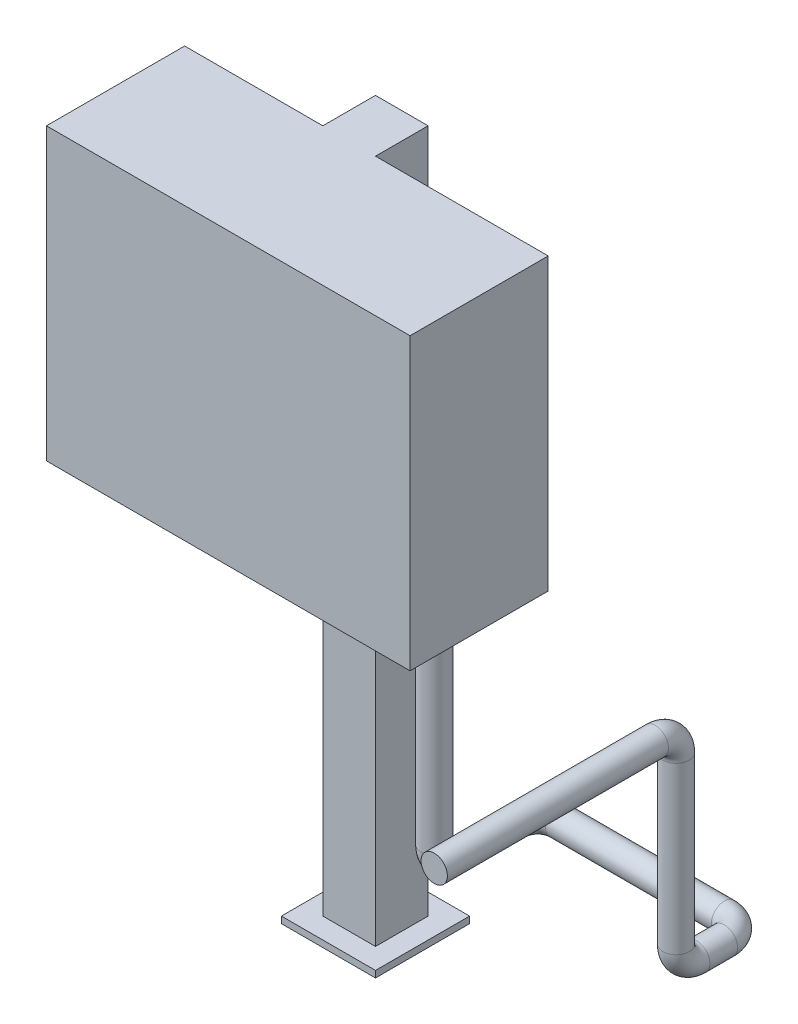
ISO-10303-21;
HEADER;
FILE_DESCRIPTION(('STEP AP214'),'2;1');
FILE_NAME('part.step','',(''),(''),'','','');
FILE_SCHEMA(('AUTOMOTIVE_DESIGN { 1 0 10303 214 1 1 1 1 }'));
ENDSEC;
DATA;
#1=APPLICATION_CONTEXT('core data for automotive mechanical design processes');
#2=APPLICATION_PROTOCOL_DEFINITION('international standard','automotive_design',2000,#1);
#3=PRODUCT_CONTEXT('',#1,'mechanical');
#4=PRODUCT('Part','Part','',(#3));
#5=PRODUCT_RELATED_PRODUCT_CATEGORY('part','',(#4));
#6=PRODUCT_DEFINITION_FORMATION('','',#4);
#7=PRODUCT_DEFINITION_CONTEXT('part definition',#1,'design');
#8=PRODUCT_DEFINITION('design','',#6,#7);
#9=PRODUCT_DEFINITION_SHAPE('','',#8);
#10=(LENGTH_UNIT() NAMED_UNIT(*) SI_UNIT(.MILLI.,.METRE.));
#11=(NAMED_UNIT(*) PLANE_ANGLE_UNIT() SI_UNIT($,.RADIAN.));
#12=(NAMED_UNIT(*) SI_UNIT($,.STERADIAN.) SOLID_ANGLE_UNIT());
#13=UNCERTAINTY_MEASURE_WITH_UNIT(LENGTH_MEASURE(1.E-05),#10,'distance_accuracy_value','');
#14=(GEOMETRIC_REPRESENTATION_CONTEXT(3) GLOBAL_UNCERTAINTY_ASSIGNED_CONTEXT((#13)) GLOBAL_UNIT_ASSIGNED_CONTEXT((#10,
#11,#12)) REPRESENTATION_CONTEXT('',''));
#15=CARTESIAN_POINT('',(0.,0.,0.));
#16=DIRECTION('',(0.,0.,1.));
#17=DIRECTION('',(1.,0.,0.));
#18=AXIS2_PLACEMENT_3D('',#15,#16,#17);
#19=CARTESIAN_POINT('',(0.,0.,76.2));
#20=DIRECTION('',(0.,0.,-1.));
#21=DIRECTION('',(-1.,0.,0.));
#22=AXIS2_PLACEMENT_3D('',#19,#20,#21);
#23=PLANE('',#22);
#24=DIRECTION('',(1.,0.,0.));
#25=VECTOR('',#24,1.);
#26=CARTESIAN_POINT('',(-200.,580.,76.2));
#27=LINE('',#26,#25);
#28=CARTESIAN_POINT('',(0.,580.,76.2));
#29=VERTEX_POINT('',#28);
#30=CARTESIAN_POINT('',(76.2,580.,76.2));
#31=VERTEX_POINT('',#30);
#32=EDGE_CURVE('E50',#29,#31,#27,.T.);
#33=ORIENTED_EDGE('',*,*,#32,.F.);
#34=DIRECTION('',(0.,-1.,0.));
#35=VECTOR('',#34,1.);
#36=CARTESIAN_POINT('',(0.,0.,76.2));
#37=LINE('',#36,#35);
#38=CARTESIAN_POINT('',(0.,9.525,76.2));
#39=VERTEX_POINT('',#38);
#40=EDGE_CURVE('E222',#29,#39,#37,.T.);
#41=ORIENTED_EDGE('',*,*,#40,.T.);
#42=DIRECTION('',(-1.,0.,0.));
#43=VECTOR('',#42,1.);
#44=CARTESIAN_POINT('',(0.,9.525,76.2));
#45=LINE('',#44,#43);
#46=CARTESIAN_POINT('',(76.2,9.525,76.2));
#47=VERTEX_POINT('',#46);
#48=EDGE_CURVE('E214',#47,#39,#45,.T.);
#49=ORIENTED_EDGE('',*,*,#48,.F.);
#50=DIRECTION('',(0.,1.,0.));
#51=VECTOR('',#50,1.);
#52=CARTESIAN_POINT('',(76.2,0.,76.2));
#53=LINE('',#52,#51);
#54=EDGE_CURVE('E221',#47,#31,#53,.T.);
#55=ORIENTED_EDGE('',*,*,#54,.T.);
#56=EDGE_LOOP('',(#33,#41,#49,#55));
#57=FACE_BOUND('',#56,.T.);
#58=ADVANCED_FACE('F35',(#57),#23,.F.);
#59=CARTESIAN_POINT('',(0.,0.,76.2));
#60=DIRECTION('',(1.,0.,0.));
#61=DIRECTION('',(0.,0.,-1.));
#62=AXIS2_PLACEMENT_3D('',#59,#60,#61);
#63=PLANE('',#62);
#64=DIRECTION('',(0.,0.,-1.));
#65=VECTOR('',#64,1.);
#66=CARTESIAN_POINT('',(0.,9.525,76.2));
#67=LINE('',#66,#65);
#68=CARTESIAN_POINT('',(0.,9.525,0.));
#69=VERTEX_POINT('',#68);
#70=EDGE_CURVE('E212',#39,#69,#67,.T.);
#71=ORIENTED_EDGE('',*,*,#70,.F.);
#72=ORIENTED_EDGE('',*,*,#40,.F.);
#73=CARTESIAN_POINT('',(0.,1000.,76.2));
#74=VERTEX_POINT('',#73);
#75=EDGE_CURVE('E218',#74,#29,#37,.T.);
#76=ORIENTED_EDGE('',*,*,#75,.F.);
#77=DIRECTION('',(0.,0.,-1.));
#78=VECTOR('',#77,1.);
#79=CARTESIAN_POINT('',(0.,1000.,76.2));
#80=LINE('',#79,#78);
#81=CARTESIAN_POINT('',(0.,1000.,0.));
#82=VERTEX_POINT('',#81);
#83=EDGE_CURVE('E224',#74,#82,#80,.T.);
#84=ORIENTED_EDGE('',*,*,#83,.T.);
#85=DIRECTION('',(0.,-1.,0.));
#86=VECTOR('',#85,1.);
#87=CARTESIAN_POINT('',(0.,0.,0.));
#88=LINE('',#87,#86);
#89=EDGE_CURVE('E217',#82,#69,#88,.T.);
#90=ORIENTED_EDGE('',*,*,#89,.T.);
#91=EDGE_LOOP('',(#71,#72,#76,#84,#90));
#92=FACE_BOUND('',#91,.T.);
#93=ADVANCED_FACE('F37',(#92),#63,.F.);
#94=CARTESIAN_POINT('',(76.2,0.,76.2));
#95=DIRECTION('',(-1.,0.,0.));
#96=DIRECTION('',(0.,0.,1.));
#97=AXIS2_PLACEMENT_3D('',#94,#95,#96);
#98=PLANE('',#97);
#99=DIRECTION('',(0.,0.,1.));
#100=VECTOR('',#99,1.);
#101=CARTESIAN_POINT('',(76.2,9.525,76.2));
#102=LINE('',#101,#100);
#103=CARTESIAN_POINT('',(76.2,9.525,0.));
#104=VERTEX_POINT('',#103);
#105=EDGE_CURVE('E205',#104,#47,#102,.T.);
#106=ORIENTED_EDGE('',*,*,#105,.F.);
#107=DIRECTION('',(0.,1.,0.));
#108=VECTOR('',#107,1.);
#109=CARTESIAN_POINT('',(76.2,0.,0.));
#110=LINE('',#109,#108);
#111=CARTESIAN_POINT('',(76.2,1000.,0.));
#112=VERTEX_POINT('',#111);
#113=EDGE_CURVE('E227',#104,#112,#110,.T.);
#114=ORIENTED_EDGE('',*,*,#113,.T.);
#115=DIRECTION('',(0.,0.,-1.));
#116=VECTOR('',#115,1.);
#117=CARTESIAN_POINT('',(76.2,1000.,76.2));
#118=LINE('',#117,#116);
#119=CARTESIAN_POINT('',(76.2,1000.,76.2));
#120=VERTEX_POINT('',#119);
#121=EDGE_CURVE('E233',#120,#112,#118,.T.);
#122=ORIENTED_EDGE('',*,*,#121,.F.);
#123=DIRECTION('',(0.,1.,0.));
#124=VECTOR('',#123,1.);
#125=CARTESIAN_POINT('',(76.2,0.,76.2));
#126=LINE('',#125,#124);
#127=EDGE_CURVE('E58',#31,#120,#126,.T.);
#128=ORIENTED_EDGE('',*,*,#127,.F.);
#129=ORIENTED_EDGE('',*,*,#54,.F.);
#130=EDGE_LOOP('',(#106,#114,#122,#128,#129));
#131=FACE_BOUND('',#130,.T.);
#132=ADVANCED_FACE('F270',(#131),#98,.F.);
#133=CARTESIAN_POINT('',(0.,0.,0.));
#134=DIRECTION('',(0.,0.,-1.));
#135=DIRECTION('',(-1.,0.,0.));
#136=AXIS2_PLACEMENT_3D('',#133,#134,#135);
#137=PLANE('',#136);
#138=ORIENTED_EDGE('',*,*,#113,.F.);
#139=DIRECTION('',(-1.,0.,0.));
#140=VECTOR('',#139,1.);
#141=CARTESIAN_POINT('',(0.,9.525,0.));
#142=LINE('',#141,#140);
#143=EDGE_CURVE('E43',#104,#69,#142,.T.);
#144=ORIENTED_EDGE('',*,*,#143,.T.);
#145=ORIENTED_EDGE('',*,*,#89,.F.);
#146=DIRECTION('',(-1.,0.,0.));
#147=VECTOR('',#146,1.);
#148=CARTESIAN_POINT('',(0.,1000.,0.));
#149=LINE('',#148,#147);
#150=EDGE_CURVE('E229',#112,#82,#149,.T.);
#151=ORIENTED_EDGE('',*,*,#150,.F.);
#152=EDGE_LOOP('',(#138,#144,#145,#151));
#153=FACE_BOUND('',#152,.T.);
#154=ADVANCED_FACE('F239',(#153),#137,.T.);
#155=CARTESIAN_POINT('',(0.,1000.,76.2));
#156=DIRECTION('',(0.,-1.,0.));
#157=DIRECTION('',(0.,0.,-1.));
#158=AXIS2_PLACEMENT_3D('',#155,#156,#157);
#159=PLANE('',#158);
#160=ORIENTED_EDGE('',*,*,#150,.T.);
#161=ORIENTED_EDGE('',*,*,#83,.F.);
#162=DIRECTION('',(-1.,0.,0.));
#163=VECTOR('',#162,1.);
#164=CARTESIAN_POINT('',(-200.,1000.,76.2));
#165=LINE('',#164,#163);
#166=CARTESIAN_POINT('',(-200.,1000.,76.2));
#167=VERTEX_POINT('',#166);
#168=EDGE_CURVE('E163',#74,#167,#165,.T.);
#169=ORIENTED_EDGE('',*,*,#168,.T.);
#170=DIRECTION('',(0.,0.,-1.));
#171=VECTOR('',#170,1.);
#172=CARTESIAN_POINT('',(-200.,1000.,276.2));
#173=LINE('',#172,#171);
#174=CARTESIAN_POINT('',(-200.,1000.,276.2));
#175=VERTEX_POINT('',#174);
#176=EDGE_CURVE('E156',#175,#167,#173,.T.);
#177=ORIENTED_EDGE('',*,*,#176,.F.);
#178=DIRECTION('',(-1.,0.,0.));
#179=VECTOR('',#178,1.);
#180=CARTESIAN_POINT('',(-200.,1000.,276.2));
#181=LINE('',#180,#179);
#182=CARTESIAN_POINT('',(326.2,1000.,276.2));
#183=VERTEX_POINT('',#182);
#184=EDGE_CURVE('E155',#183,#175,#181,.T.);
#185=ORIENTED_EDGE('',*,*,#184,.F.);
#186=DIRECTION('',(0.,0.,-1.));
#187=VECTOR('',#186,1.);
#188=CARTESIAN_POINT('',(326.2,1000.,276.2));
#189=LINE('',#188,#187);
#190=CARTESIAN_POINT('',(326.2,1000.,76.2));
#191=VERTEX_POINT('',#190);
#192=EDGE_CURVE('E168',#183,#191,#189,.T.);
#193=ORIENTED_EDGE('',*,*,#192,.T.);
#194=EDGE_CURVE('E151',#191,#120,#165,.T.);
#195=ORIENTED_EDGE('',*,*,#194,.T.);
#196=ORIENTED_EDGE('',*,*,#121,.T.);
#197=EDGE_LOOP('',(#160,#161,#169,#177,#185,#193,#195,#196));
#198=FACE_BOUND('',#197,.T.);
#199=ADVANCED_FACE('F248',(#198),#159,.F.);
#200=CARTESIAN_POINT('',(0.,9.525,0.));
#201=DIRECTION('',(0.,-1.,0.));
#202=DIRECTION('',(0.,0.,-1.));
#203=AXIS2_PLACEMENT_3D('',#200,#201,#202);
#204=PLANE('',#203);
#205=DIRECTION('',(0.,0.,-1.));
#206=VECTOR('',#205,1.);
#207=CARTESIAN_POINT('',(-30.,9.525,-30.));
#208=LINE('',#207,#206);
#209=CARTESIAN_POINT('',(-30.,9.525,106.2));
#210=VERTEX_POINT('',#209);
#211=CARTESIAN_POINT('',(-30.,9.525,-30.));
#212=VERTEX_POINT('',#211);
#213=EDGE_CURVE('E179',#210,#212,#208,.T.);
#214=ORIENTED_EDGE('',*,*,#213,.F.);
#215=DIRECTION('',(-1.,0.,0.));
#216=VECTOR('',#215,1.);
#217=CARTESIAN_POINT('',(106.2,9.525,106.2));
#218=LINE('',#217,#216);
#219=CARTESIAN_POINT('',(106.2,9.525,106.2));
#220=VERTEX_POINT('',#219);
#221=EDGE_CURVE('E189',#220,#210,#218,.T.);
#222=ORIENTED_EDGE('',*,*,#221,.F.);
#223=DIRECTION('',(0.,0.,1.));
#224=VECTOR('',#223,1.);
#225=CARTESIAN_POINT('',(106.2,9.525,-30.));
#226=LINE('',#225,#224);
#227=CARTESIAN_POINT('',(106.2,9.525,-30.));
#228=VERTEX_POINT('',#227);
#229=EDGE_CURVE('E186',#228,#220,#226,.T.);
#230=ORIENTED_EDGE('',*,*,#229,.F.);
#231=DIRECTION('',(1.,0.,0.));
#232=VECTOR('',#231,1.);
#233=CARTESIAN_POINT('',(106.2,9.525,-30.));
#234=LINE('',#233,#232);
#235=EDGE_CURVE('E182',#212,#228,#234,.T.);
#236=ORIENTED_EDGE('',*,*,#235,.F.);
#237=EDGE_LOOP('',(#214,#222,#230,#236));
#238=FACE_BOUND('',#237,.T.);
#239=ORIENTED_EDGE('',*,*,#105,.T.);
#240=ORIENTED_EDGE('',*,*,#48,.T.);
#241=ORIENTED_EDGE('',*,*,#70,.T.);
#242=ORIENTED_EDGE('',*,*,#143,.F.);
#243=EDGE_LOOP('',(#239,#240,#241,#242));
#244=FACE_BOUND('',#243,.T.);
#245=ADVANCED_FACE('F272',(#238,#244),#204,.F.);
#246=CARTESIAN_POINT('',(-30.,9.525,-30.));
#247=DIRECTION('',(-1.,0.,0.));
#248=DIRECTION('',(0.,0.,1.));
#249=AXIS2_PLACEMENT_3D('',#246,#247,#248);
#250=PLANE('',#249);
#251=DIRECTION('',(0.,0.,-1.));
#252=VECTOR('',#251,1.);
#253=CARTESIAN_POINT('',(-30.,0.,-30.));
#254=LINE('',#253,#252);
#255=CARTESIAN_POINT('',(-30.,0.,106.2));
#256=VERTEX_POINT('',#255);
#257=CARTESIAN_POINT('',(-30.,0.,-30.));
#258=VERTEX_POINT('',#257);
#259=EDGE_CURVE('E178',#256,#258,#254,.T.);
#260=ORIENTED_EDGE('',*,*,#259,.F.);
#261=DIRECTION('',(0.,-1.,0.));
#262=VECTOR('',#261,1.);
#263=CARTESIAN_POINT('',(-30.,9.525,106.2));
#264=LINE('',#263,#262);
#265=EDGE_CURVE('E203',#210,#256,#264,.T.);
#266=ORIENTED_EDGE('',*,*,#265,.F.);
#267=ORIENTED_EDGE('',*,*,#213,.T.);
#268=DIRECTION('',(0.,-1.,0.));
#269=VECTOR('',#268,1.);
#270=CARTESIAN_POINT('',(-30.,9.525,-30.));
#271=LINE('',#270,#269);
#272=EDGE_CURVE('E192',#212,#258,#271,.T.);
#273=ORIENTED_EDGE('',*,*,#272,.T.);
#274=EDGE_LOOP('',(#260,#266,#267,#273));
#275=FACE_BOUND('',#274,.T.);
#276=ADVANCED_FACE('F280',(#275),#250,.T.);
#277=CARTESIAN_POINT('',(106.2,9.525,106.2));
#278=DIRECTION('',(0.,0.,1.));
#279=DIRECTION('',(1.,0.,0.));
#280=AXIS2_PLACEMENT_3D('',#277,#278,#279);
#281=PLANE('',#280);
#282=DIRECTION('',(-1.,0.,0.));
#283=VECTOR('',#282,1.);
#284=CARTESIAN_POINT('',(106.2,0.,106.2));
#285=LINE('',#284,#283);
#286=CARTESIAN_POINT('',(106.2,0.,106.2));
#287=VERTEX_POINT('',#286);
#288=EDGE_CURVE('E183',#287,#256,#285,.T.);
#289=ORIENTED_EDGE('',*,*,#288,.F.);
#290=DIRECTION('',(0.,-1.,0.));
#291=VECTOR('',#290,1.);
#292=CARTESIAN_POINT('',(106.2,9.525,106.2));
#293=LINE('',#292,#291);
#294=EDGE_CURVE('E206',#220,#287,#293,.T.);
#295=ORIENTED_EDGE('',*,*,#294,.F.);
#296=ORIENTED_EDGE('',*,*,#221,.T.);
#297=ORIENTED_EDGE('',*,*,#265,.T.);
#298=EDGE_LOOP('',(#289,#295,#296,#297));
#299=FACE_BOUND('',#298,.T.);
#300=ADVANCED_FACE('F308',(#299),#281,.T.);
#301=CARTESIAN_POINT('',(106.2,9.525,-30.));
#302=DIRECTION('',(1.,0.,0.));
#303=DIRECTION('',(0.,0.,-1.));
#304=AXIS2_PLACEMENT_3D('',#301,#302,#303);
#305=PLANE('',#304);
#306=DIRECTION('',(0.,0.,1.));
#307=VECTOR('',#306,1.);
#308=CARTESIAN_POINT('',(106.2,0.,-30.));
#309=LINE('',#308,#307);
#310=CARTESIAN_POINT('',(106.2,0.,-30.));
#311=VERTEX_POINT('',#310);
#312=EDGE_CURVE('E198',#311,#287,#309,.T.);
#313=ORIENTED_EDGE('',*,*,#312,.F.);
#314=DIRECTION('',(0.,-1.,0.));
#315=VECTOR('',#314,1.);
#316=CARTESIAN_POINT('',(106.2,9.525,-30.));
#317=LINE('',#316,#315);
#318=EDGE_CURVE('E208',#228,#311,#317,.T.);
#319=ORIENTED_EDGE('',*,*,#318,.F.);
#320=ORIENTED_EDGE('',*,*,#229,.T.);
#321=ORIENTED_EDGE('',*,*,#294,.T.);
#322=EDGE_LOOP('',(#313,#319,#320,#321));
#323=FACE_BOUND('',#322,.T.);
#324=ADVANCED_FACE('F296',(#323),#305,.T.);
#325=CARTESIAN_POINT('',(106.2,9.525,-30.));
#326=DIRECTION('',(0.,0.,-1.));
#327=DIRECTION('',(-1.,0.,0.));
#328=AXIS2_PLACEMENT_3D('',#325,#326,#327);
#329=PLANE('',#328);
#330=DIRECTION('',(1.,0.,0.));
#331=VECTOR('',#330,1.);
#332=CARTESIAN_POINT('',(106.2,0.,-30.));
#333=LINE('',#332,#331);
#334=EDGE_CURVE('E195',#258,#311,#333,.T.);
#335=ORIENTED_EDGE('',*,*,#334,.F.);
#336=ORIENTED_EDGE('',*,*,#272,.F.);
#337=ORIENTED_EDGE('',*,*,#235,.T.);
#338=ORIENTED_EDGE('',*,*,#318,.T.);
#339=EDGE_LOOP('',(#335,#336,#337,#338));
#340=FACE_BOUND('',#339,.T.);
#341=ADVANCED_FACE('F289',(#340),#329,.T.);
#342=CARTESIAN_POINT('',(0.,0.,76.2));
#343=DIRECTION('',(0.,1.,0.));
#344=DIRECTION('',(0.,0.,1.));
#345=AXIS2_PLACEMENT_3D('',#342,#343,#344);
#346=PLANE('',#345);
#347=ORIENTED_EDGE('',*,*,#259,.T.);
#348=ORIENTED_EDGE('',*,*,#334,.T.);
#349=ORIENTED_EDGE('',*,*,#312,.T.);
#350=ORIENTED_EDGE('',*,*,#288,.T.);
#351=EDGE_LOOP('',(#347,#348,#349,#350));
#352=FACE_BOUND('',#351,.T.);
#353=ADVANCED_FACE('F287',(#352),#346,.F.);
#354=CARTESIAN_POINT('',(0.,0.,76.2));
#355=DIRECTION('',(0.,0.,1.));
#356=DIRECTION('',(1.,0.,0.));
#357=AXIS2_PLACEMENT_3D('',#354,#355,#356);
#358=PLANE('',#357);
#359=ORIENTED_EDGE('',*,*,#168,.F.);
#360=ORIENTED_EDGE('',*,*,#75,.T.);
#361=CARTESIAN_POINT('',(-200.,580.,76.2));
#362=VERTEX_POINT('',#361);
#363=EDGE_CURVE('E158',#362,#29,#27,.T.);
#364=ORIENTED_EDGE('',*,*,#363,.F.);
#365=DIRECTION('',(0.,-1.,0.));
#366=VECTOR('',#365,1.);
#367=CARTESIAN_POINT('',(-200.,1000.,76.2));
#368=LINE('',#367,#366);
#369=EDGE_CURVE('E136',#167,#362,#368,.T.);
#370=ORIENTED_EDGE('',*,*,#369,.F.);
#371=EDGE_LOOP('',(#359,#360,#364,#370));
#372=FACE_BOUND('',#371,.T.);
#373=ADVANCED_FACE('F252',(#372),#358,.F.);
#374=CARTESIAN_POINT('',(326.2,580.,76.2));
#375=VERTEX_POINT('',#374);
#376=EDGE_CURVE('E140',#31,#375,#27,.T.);
#377=ORIENTED_EDGE('',*,*,#376,.F.);
#378=ORIENTED_EDGE('',*,*,#127,.T.);
#379=ORIENTED_EDGE('',*,*,#194,.F.);
#380=DIRECTION('',(0.,1.,0.));
#381=VECTOR('',#380,1.);
#382=CARTESIAN_POINT('',(326.2,1000.,76.2));
#383=LINE('',#382,#381);
#384=EDGE_CURVE('E161',#375,#191,#383,.T.);
#385=ORIENTED_EDGE('',*,*,#384,.F.);
#386=EDGE_LOOP('',(#377,#378,#379,#385));
#387=FACE_BOUND('',#386,.T.);
#388=ADVANCED_FACE('F269',(#387),#358,.F.);
#389=CARTESIAN_POINT('',(-200.,1000.,276.2));
#390=DIRECTION('',(1.,0.,0.));
#391=DIRECTION('',(0.,1.,0.));
#392=AXIS2_PLACEMENT_3D('',#389,#390,#391);
#393=PLANE('',#392);
#394=ORIENTED_EDGE('',*,*,#369,.T.);
#395=DIRECTION('',(0.,0.,-1.));
#396=VECTOR('',#395,1.);
#397=CARTESIAN_POINT('',(-200.,580.,276.2));
#398=LINE('',#397,#396);
#399=CARTESIAN_POINT('',(-200.,580.,276.2));
#400=VERTEX_POINT('',#399);
#401=EDGE_CURVE('E174',#400,#362,#398,.T.);
#402=ORIENTED_EDGE('',*,*,#401,.F.);
#403=DIRECTION('',(0.,-1.,0.));
#404=VECTOR('',#403,1.);
#405=CARTESIAN_POINT('',(-200.,1000.,276.2));
#406=LINE('',#405,#404);
#407=EDGE_CURVE('E147',#175,#400,#406,.T.);
#408=ORIENTED_EDGE('',*,*,#407,.F.);
#409=ORIENTED_EDGE('',*,*,#176,.T.);
#410=EDGE_LOOP('',(#394,#402,#408,#409));
#411=FACE_BOUND('',#410,.T.);
#412=ADVANCED_FACE('F255',(#411),#393,.F.);
#413=CARTESIAN_POINT('',(-200.,580.,276.2));
#414=DIRECTION('',(0.,1.,0.));
#415=DIRECTION('',(0.,0.,1.));
#416=AXIS2_PLACEMENT_3D('',#413,#414,#415);
#417=PLANE('',#416);
#418=CARTESIAN_POINT('',(261.2,580.,176.2));
#419=DIRECTION('',(0.,1.,0.));
#420=DIRECTION('',(0.,0.,1.));
#421=AXIS2_PLACEMENT_3D('',#418,#419,#420);
#422=CIRCLE('',#421,19.05);
#423=CARTESIAN_POINT('',(261.2,580.,195.25));
#424=VERTEX_POINT('',#423);
#425=EDGE_CURVE('E11',#424,#424,#422,.F.);
#426=ORIENTED_EDGE('',*,*,#425,.F.);
#427=EDGE_LOOP('',(#426));
#428=FACE_BOUND('',#427,.T.);
#429=ORIENTED_EDGE('',*,*,#363,.T.);
#430=ORIENTED_EDGE('',*,*,#32,.T.);
#431=ORIENTED_EDGE('',*,*,#376,.T.);
#432=DIRECTION('',(0.,0.,-1.));
#433=VECTOR('',#432,1.);
#434=CARTESIAN_POINT('',(326.2,580.,276.2));
#435=LINE('',#434,#433);
#436=CARTESIAN_POINT('',(326.2,580.,276.2));
#437=VERTEX_POINT('',#436);
#438=EDGE_CURVE('E171',#437,#375,#435,.T.);
#439=ORIENTED_EDGE('',*,*,#438,.F.);
#440=DIRECTION('',(1.,0.,0.));
#441=VECTOR('',#440,1.);
#442=CARTESIAN_POINT('',(-200.,580.,276.2));
#443=LINE('',#442,#441);
#444=EDGE_CURVE('E150',#400,#437,#443,.T.);
#445=ORIENTED_EDGE('',*,*,#444,.F.);
#446=ORIENTED_EDGE('',*,*,#401,.T.);
#447=EDGE_LOOP('',(#429,#430,#431,#439,#445,#446));
#448=FACE_BOUND('',#447,.T.);
#449=ADVANCED_FACE('F382',(#428,#448),#417,.F.);
#450=CARTESIAN_POINT('',(326.2,1000.,276.2));
#451=DIRECTION('',(-1.,0.,0.));
#452=DIRECTION('',(0.,-1.,0.));
#453=AXIS2_PLACEMENT_3D('',#450,#451,#452);
#454=PLANE('',#453);
#455=ORIENTED_EDGE('',*,*,#384,.T.);
#456=ORIENTED_EDGE('',*,*,#192,.F.);
#457=DIRECTION('',(0.,1.,0.));
#458=VECTOR('',#457,1.);
#459=CARTESIAN_POINT('',(326.2,1000.,276.2));
#460=LINE('',#459,#458);
#461=EDGE_CURVE('E153',#437,#183,#460,.T.);
#462=ORIENTED_EDGE('',*,*,#461,.F.);
#463=ORIENTED_EDGE('',*,*,#438,.T.);
#464=EDGE_LOOP('',(#455,#456,#462,#463));
#465=FACE_BOUND('',#464,.T.);
#466=ADVANCED_FACE('F265',(#465),#454,.F.);
#467=CARTESIAN_POINT('',(0.,0.,276.2));
#468=DIRECTION('',(0.,0.,1.));
#469=DIRECTION('',(1.,0.,0.));
#470=AXIS2_PLACEMENT_3D('',#467,#468,#469);
#471=PLANE('',#470);
#472=ORIENTED_EDGE('',*,*,#407,.T.);
#473=ORIENTED_EDGE('',*,*,#444,.T.);
#474=ORIENTED_EDGE('',*,*,#461,.T.);
#475=ORIENTED_EDGE('',*,*,#184,.T.);
#476=EDGE_LOOP('',(#472,#473,#474,#475));
#477=FACE_BOUND('',#476,.T.);
#478=ADVANCED_FACE('F261',(#477),#471,.T.);
#479=CARTESIAN_POINT('',(261.2,550.,176.2));
#480=DIRECTION('',(0.,1.,0.));
#481=DIRECTION('',(0.,0.,1.));
#482=AXIS2_PLACEMENT_3D('',#479,#480,#481);
#483=CYLINDRICAL_SURFACE('',#482,19.05);
#484=ORIENTED_EDGE('',*,*,#425,.T.);
#485=EDGE_LOOP('',(#484));
#486=FACE_BOUND('',#485,.T.);
#487=CARTESIAN_POINT('',(261.2,280.,176.2));
#488=DIRECTION('',(0.,-1.,0.));
#489=DIRECTION('',(0.,0.,-1.));
#490=AXIS2_PLACEMENT_3D('',#487,#488,#489);
#491=CIRCLE('',#490,19.05);
#492=CARTESIAN_POINT('',(261.2,280.,195.25));
#493=VERTEX_POINT('',#492);
#494=EDGE_CURVE('E554',#493,#493,#491,.T.);
#495=ORIENTED_EDGE('',*,*,#494,.F.);
#496=EDGE_LOOP('',(#495));
#497=FACE_BOUND('',#496,.T.);
#498=ADVANCED_FACE('F400',(#486,#497),#483,.T.);
#499=CARTESIAN_POINT('',(561.2,550.,476.2));
#500=DIRECTION('',(0.,0.,1.));
#501=DIRECTION('',(0.,1.,0.));
#502=AXIS2_PLACEMENT_3D('',#499,#500,#501);
#503=PLANE('',#502);
#504=CARTESIAN_POINT('',(561.2,550.,476.2));
#505=DIRECTION('',(0.,0.,1.));
#506=DIRECTION('',(0.,1.,0.));
#507=AXIS2_PLACEMENT_3D('',#504,#505,#506);
#508=CIRCLE('',#507,19.05);
#509=CARTESIAN_POINT('',(561.2,569.05,476.2));
#510=VERTEX_POINT('',#509);
#511=EDGE_CURVE('E133',#510,#510,#508,.T.);
#512=ORIENTED_EDGE('',*,*,#511,.T.);
#513=EDGE_LOOP('',(#512));
#514=FACE_BOUND('',#513,.T.);
#515=ADVANCED_FACE('F134',(#514),#503,.T.);
#516=CARTESIAN_POINT('',(261.2,280.,146.2));
#517=DIRECTION('',(1.,0.,0.));
#518=DIRECTION('',(0.,0.,-1.));
#519=AXIS2_PLACEMENT_3D('',#516,#517,#518);
#520=TOROIDAL_SURFACE('',#519,30.,19.05);
#521=CARTESIAN_POINT('',(261.2,250.,146.2));
#522=DIRECTION('',(0.,0.,-1.));
#523=DIRECTION('',(0.,1.,0.));
#524=AXIS2_PLACEMENT_3D('',#521,#522,#523);
#525=CIRCLE('',#524,19.05);
#526=CARTESIAN_POINT('',(261.2,230.95,146.2));
#527=VERTEX_POINT('',#526);
#528=EDGE_CURVE('E551',#527,#527,#525,.T.);
#529=CARTESIAN_POINT('',(261.2,280.,146.2));
#530=DIRECTION('',(1.,0.,0.));
#531=DIRECTION('',(0.,0.,-1.));
#532=AXIS2_PLACEMENT_3D('',#529,#530,#531);
#533=CIRCLE('',#532,49.05);
#534=EDGE_CURVE('',#493,#527,#533,.T.);
#535=ORIENTED_EDGE('',*,*,#494,.T.);
#536=ORIENTED_EDGE('',*,*,#528,.F.);
#537=ORIENTED_EDGE('',*,*,#534,.T.);
#538=ORIENTED_EDGE('',*,*,#534,.F.);
#539=EDGE_LOOP('',(#535,#537,#536,#538));
#540=FACE_BOUND('',#539,.T.);
#541=ADVANCED_FACE('F426',(#540),#520,.T.);
#542=CARTESIAN_POINT('',(261.2,250.,146.2));
#543=DIRECTION('',(0.,0.,-1.));
#544=DIRECTION('',(-1.,0.,0.));
#545=AXIS2_PLACEMENT_3D('',#542,#543,#544);
#546=CYLINDRICAL_SURFACE('',#545,19.05);
#547=CARTESIAN_POINT('',(261.2,250.,56.2));
#548=DIRECTION('',(0.,0.,-1.));
#549=DIRECTION('',(0.,1.,0.));
#550=AXIS2_PLACEMENT_3D('',#547,#548,#549);
#551=CIRCLE('',#550,19.05);
#552=CARTESIAN_POINT('',(242.15,250.,56.2));
#553=VERTEX_POINT('',#552);
#554=EDGE_CURVE('E548',#553,#553,#551,.T.);
#555=ORIENTED_EDGE('',*,*,#554,.F.);
#556=EDGE_LOOP('',(#555));
#557=FACE_BOUND('',#556,.T.);
#558=ORIENTED_EDGE('',*,*,#528,.T.);
#559=EDGE_LOOP('',(#558));
#560=FACE_BOUND('',#559,.T.);
#561=ADVANCED_FACE('F435',(#557,#560),#546,.T.);
#562=CARTESIAN_POINT('',(291.2,250.,56.2));
#563=DIRECTION('',(0.,-1.,0.));
#564=DIRECTION('',(0.,0.,-1.));
#565=AXIS2_PLACEMENT_3D('',#562,#563,#564);
#566=TOROIDAL_SURFACE('',#565,30.,19.05);
#567=CARTESIAN_POINT('',(291.2,250.,26.2));
#568=DIRECTION('',(1.,0.,0.));
#569=DIRECTION('',(0.,1.,0.));
#570=AXIS2_PLACEMENT_3D('',#567,#568,#569);
#571=CIRCLE('',#570,19.05);
#572=CARTESIAN_POINT('',(291.2,250.,7.14999999999998));
#573=VERTEX_POINT('',#572);
#574=EDGE_CURVE('E545',#573,#573,#571,.T.);
#575=CARTESIAN_POINT('',(291.2,250.,56.2));
#576=DIRECTION('',(0.,-1.,0.));
#577=DIRECTION('',(0.,0.,-1.));
#578=AXIS2_PLACEMENT_3D('',#575,#576,#577);
#579=CIRCLE('',#578,49.05);
#580=EDGE_CURVE('',#553,#573,#579,.T.);
#581=ORIENTED_EDGE('',*,*,#554,.T.);
#582=ORIENTED_EDGE('',*,*,#574,.F.);
#583=ORIENTED_EDGE('',*,*,#580,.T.);
#584=ORIENTED_EDGE('',*,*,#580,.F.);
#585=EDGE_LOOP('',(#581,#583,#582,#584));
#586=FACE_BOUND('',#585,.T.);
#587=ADVANCED_FACE('F445',(#586),#566,.T.);
#588=CARTESIAN_POINT('',(291.2,250.,26.2));
#589=DIRECTION('',(1.,0.,0.));
#590=DIRECTION('',(0.,0.,-1.));
#591=AXIS2_PLACEMENT_3D('',#588,#589,#590);
#592=CYLINDRICAL_SURFACE('',#591,19.05);
#593=CARTESIAN_POINT('',(531.2,250.,26.2));
#594=DIRECTION('',(1.,0.,0.));
#595=DIRECTION('',(0.,1.,0.));
#596=AXIS2_PLACEMENT_3D('',#593,#594,#595);
#597=CIRCLE('',#596,19.05);
#598=CARTESIAN_POINT('',(531.2,250.,7.15000000000001));
#599=VERTEX_POINT('',#598);
#600=EDGE_CURVE('E542',#599,#599,#597,.T.);
#601=ORIENTED_EDGE('',*,*,#600,.F.);
#602=EDGE_LOOP('',(#601));
#603=FACE_BOUND('',#602,.T.);
#604=ORIENTED_EDGE('',*,*,#574,.T.);
#605=EDGE_LOOP('',(#604));
#606=FACE_BOUND('',#605,.T.);
#607=ADVANCED_FACE('F455',(#603,#606),#592,.T.);
#608=CARTESIAN_POINT('',(531.2,250.,56.2));
#609=DIRECTION('',(0.,-1.,0.));
#610=DIRECTION('',(0.,0.,-1.));
#611=AXIS2_PLACEMENT_3D('',#608,#609,#610);
#612=TOROIDAL_SURFACE('',#611,30.,19.05);
#613=CARTESIAN_POINT('',(561.2,250.,56.2));
#614=DIRECTION('',(0.,0.,1.));
#615=DIRECTION('',(0.,1.,0.));
#616=AXIS2_PLACEMENT_3D('',#613,#614,#615);
#617=CIRCLE('',#616,19.05);
#618=CARTESIAN_POINT('',(580.25,250.,56.2));
#619=VERTEX_POINT('',#618);
#620=EDGE_CURVE('E539',#619,#619,#617,.T.);
#621=CARTESIAN_POINT('',(531.2,250.,56.2));
#622=DIRECTION('',(0.,-1.,0.));
#623=DIRECTION('',(0.,0.,-1.));
#624=AXIS2_PLACEMENT_3D('',#621,#622,#623);
#625=CIRCLE('',#624,49.05);
#626=EDGE_CURVE('',#599,#619,#625,.T.);
#627=ORIENTED_EDGE('',*,*,#600,.T.);
#628=ORIENTED_EDGE('',*,*,#620,.F.);
#629=ORIENTED_EDGE('',*,*,#626,.T.);
#630=ORIENTED_EDGE('',*,*,#626,.F.);
#631=EDGE_LOOP('',(#627,#629,#628,#630));
#632=FACE_BOUND('',#631,.T.);
#633=ADVANCED_FACE('F465',(#632),#612,.T.);
#634=CARTESIAN_POINT('',(561.2,250.,56.2));
#635=DIRECTION('',(0.,0.,1.));
#636=DIRECTION('',(1.,0.,0.));
#637=AXIS2_PLACEMENT_3D('',#634,#635,#636);
#638=CYLINDRICAL_SURFACE('',#637,19.05);
#639=CARTESIAN_POINT('',(561.2,250.,96.2000000000001));
#640=DIRECTION('',(0.,0.,1.));
#641=DIRECTION('',(0.,1.,0.));
#642=AXIS2_PLACEMENT_3D('',#639,#640,#641);
#643=CIRCLE('',#642,19.05);
#644=CARTESIAN_POINT('',(561.2,230.95,96.2000000000001));
#645=VERTEX_POINT('',#644);
#646=EDGE_CURVE('E534',#645,#645,#643,.T.);
#647=ORIENTED_EDGE('',*,*,#646,.F.);
#648=EDGE_LOOP('',(#647));
#649=FACE_BOUND('',#648,.T.);
#650=ORIENTED_EDGE('',*,*,#620,.T.);
#651=EDGE_LOOP('',(#650));
#652=FACE_BOUND('',#651,.T.);
#653=ADVANCED_FACE('F475',(#649,#652),#638,.T.);
#654=CARTESIAN_POINT('',(561.2,280.,96.2));
#655=DIRECTION('',(-1.,0.,0.));
#656=DIRECTION('',(0.,0.,1.));
#657=AXIS2_PLACEMENT_3D('',#654,#655,#656);
#658=TOROIDAL_SURFACE('',#657,30.,19.05);
#659=CARTESIAN_POINT('',(561.2,280.,126.2));
#660=DIRECTION('',(0.,1.,0.));
#661=DIRECTION('',(0.,0.,-1.));
#662=AXIS2_PLACEMENT_3D('',#659,#660,#661);
#663=CIRCLE('',#662,19.05);
#664=CARTESIAN_POINT('',(561.2,280.,145.25));
#665=VERTEX_POINT('',#664);
#666=EDGE_CURVE('E532',#665,#665,#663,.T.);
#667=CARTESIAN_POINT('',(561.2,280.,96.2));
#668=DIRECTION('',(-1.,0.,0.));
#669=DIRECTION('',(0.,0.,1.));
#670=AXIS2_PLACEMENT_3D('',#667,#668,#669);
#671=CIRCLE('',#670,49.05);
#672=EDGE_CURVE('',#645,#665,#671,.T.);
#673=ORIENTED_EDGE('',*,*,#646,.T.);
#674=ORIENTED_EDGE('',*,*,#666,.F.);
#675=ORIENTED_EDGE('',*,*,#672,.T.);
#676=ORIENTED_EDGE('',*,*,#672,.F.);
#677=EDGE_LOOP('',(#673,#675,#674,#676));
#678=FACE_BOUND('',#677,.T.);
#679=ADVANCED_FACE('F485',(#678),#658,.T.);
#680=CARTESIAN_POINT('',(561.2,280.,126.2));
#681=DIRECTION('',(0.,1.,0.));
#682=DIRECTION('',(0.,0.,1.));
#683=AXIS2_PLACEMENT_3D('',#680,#681,#682);
#684=CYLINDRICAL_SURFACE('',#683,19.05);
#685=CARTESIAN_POINT('',(561.2,520.,126.2));
#686=DIRECTION('',(0.,1.,0.));
#687=DIRECTION('',(0.,0.,-1.));
#688=AXIS2_PLACEMENT_3D('',#685,#686,#687);
#689=CIRCLE('',#688,19.05);
#690=CARTESIAN_POINT('',(561.2,520.,107.15));
#691=VERTEX_POINT('',#690);
#692=EDGE_CURVE('E143',#691,#691,#689,.T.);
#693=ORIENTED_EDGE('',*,*,#692,.F.);
#694=EDGE_LOOP('',(#693));
#695=FACE_BOUND('',#694,.T.);
#696=ORIENTED_EDGE('',*,*,#666,.T.);
#697=EDGE_LOOP('',(#696));
#698=FACE_BOUND('',#697,.T.);
#699=ADVANCED_FACE('F495',(#695,#698),#684,.T.);
#700=CARTESIAN_POINT('',(561.2,520.,156.2));
#701=DIRECTION('',(1.,0.,0.));
#702=DIRECTION('',(0.,0.,-1.));
#703=AXIS2_PLACEMENT_3D('',#700,#701,#702);
#704=TOROIDAL_SURFACE('',#703,30.,19.05);
#705=CARTESIAN_POINT('',(561.2,550.,156.2));
#706=DIRECTION('',(0.,0.,1.));
#707=DIRECTION('',(0.,1.,0.));
#708=AXIS2_PLACEMENT_3D('',#705,#706,#707);
#709=CIRCLE('',#708,19.05);
#710=CARTESIAN_POINT('',(561.2,569.05,156.2));
#711=VERTEX_POINT('',#710);
#712=EDGE_CURVE('E137',#711,#711,#709,.T.);
#713=CARTESIAN_POINT('',(561.2,520.,156.2));
#714=DIRECTION('',(1.,0.,0.));
#715=DIRECTION('',(0.,0.,-1.));
#716=AXIS2_PLACEMENT_3D('',#713,#714,#715);
#717=CIRCLE('',#716,49.05);
#718=EDGE_CURVE('',#691,#711,#717,.T.);
#719=ORIENTED_EDGE('',*,*,#692,.T.);
#720=ORIENTED_EDGE('',*,*,#712,.F.);
#721=ORIENTED_EDGE('',*,*,#718,.T.);
#722=ORIENTED_EDGE('',*,*,#718,.F.);
#723=EDGE_LOOP('',(#719,#721,#720,#722));
#724=FACE_BOUND('',#723,.T.);
#725=ADVANCED_FACE('F505',(#724),#704,.T.);
#726=CARTESIAN_POINT('',(561.2,550.,156.2));
#727=DIRECTION('',(0.,0.,1.));
#728=DIRECTION('',(1.,0.,0.));
#729=AXIS2_PLACEMENT_3D('',#726,#727,#728);
#730=CYLINDRICAL_SURFACE('',#729,19.05);
#731=ORIENTED_EDGE('',*,*,#511,.F.);
#732=EDGE_LOOP('',(#731));
#733=FACE_BOUND('',#732,.T.);
#734=ORIENTED_EDGE('',*,*,#712,.T.);
#735=EDGE_LOOP('',(#734));
#736=FACE_BOUND('',#735,.T.);
#737=ADVANCED_FACE('F418',(#733,#736),#730,.T.);
#738=CLOSED_SHELL('',(#58,#93,#132,#154,#199,#245,#276,#300,#324,#341,#353,#373,#388,#412,#449,
#466,#478,#498,#515,#541,#561,#587,#607,#633,#653,#679,#699,#725,#737));
#739=MANIFOLD_SOLID_BREP('B2',#738);
#740=ADVANCED_BREP_SHAPE_REPRESENTATION('',(#18,#739),#14);
#741=SHAPE_DEFINITION_REPRESENTATION(#9,#740);
ENDSEC;
END-ISO-10303-21;
